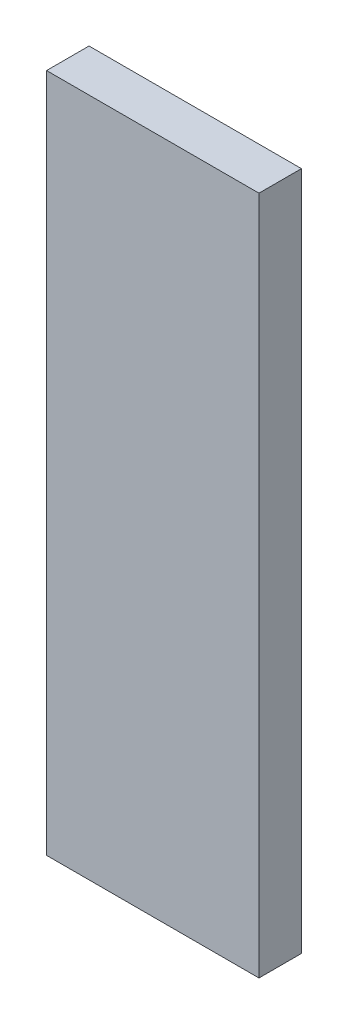
ISO-10303-21;
HEADER;
FILE_DESCRIPTION(('STEP AP214'),'2;1');
FILE_NAME('part.step','',(''),(''),'','','');
FILE_SCHEMA(('AUTOMOTIVE_DESIGN { 1 0 10303 214 1 1 1 1 }'));
ENDSEC;
DATA;
#1=APPLICATION_CONTEXT('core data for automotive mechanical design processes');
#2=APPLICATION_PROTOCOL_DEFINITION('international standard','automotive_design',2000,#1);
#3=PRODUCT_CONTEXT('',#1,'mechanical');
#4=PRODUCT('Part','Part','',(#3));
#5=PRODUCT_RELATED_PRODUCT_CATEGORY('part','',(#4));
#6=PRODUCT_DEFINITION_FORMATION('','',#4);
#7=PRODUCT_DEFINITION_CONTEXT('part definition',#1,'design');
#8=PRODUCT_DEFINITION('design','',#6,#7);
#9=PRODUCT_DEFINITION_SHAPE('','',#8);
#10=(LENGTH_UNIT() NAMED_UNIT(*) SI_UNIT(.MILLI.,.METRE.));
#11=(NAMED_UNIT(*) PLANE_ANGLE_UNIT() SI_UNIT($,.RADIAN.));
#12=(NAMED_UNIT(*) SI_UNIT($,.STERADIAN.) SOLID_ANGLE_UNIT());
#13=UNCERTAINTY_MEASURE_WITH_UNIT(LENGTH_MEASURE(1.E-05),#10,'distance_accuracy_value','');
#14=(GEOMETRIC_REPRESENTATION_CONTEXT(3) GLOBAL_UNCERTAINTY_ASSIGNED_CONTEXT((#13)) GLOBAL_UNIT_ASSIGNED_CONTEXT((#10,
#11,#12)) REPRESENTATION_CONTEXT('',''));
#15=CARTESIAN_POINT('',(0.,0.,0.));
#16=DIRECTION('',(0.,0.,1.));
#17=DIRECTION('',(1.,0.,0.));
#18=AXIS2_PLACEMENT_3D('',#15,#16,#17);
#19=CARTESIAN_POINT('',(25.,-80.,5.));
#20=DIRECTION('',(-1.,0.,0.));
#21=DIRECTION('',(0.,0.,1.));
#22=AXIS2_PLACEMENT_3D('',#19,#20,#21);
#23=PLANE('',#22);
#24=DIRECTION('',(0.,1.,0.));
#25=VECTOR('',#24,1.);
#26=CARTESIAN_POINT('',(25.,-80.,-5.));
#27=LINE('',#26,#25);
#28=CARTESIAN_POINT('',(25.,-80.,-5.));
#29=VERTEX_POINT('',#28);
#30=CARTESIAN_POINT('',(25.,80.,-5.));
#31=VERTEX_POINT('',#30);
#32=EDGE_CURVE('E102',#29,#31,#27,.T.);
#33=ORIENTED_EDGE('',*,*,#32,.T.);
#34=DIRECTION('',(0.,0.,-1.));
#35=VECTOR('',#34,1.);
#36=CARTESIAN_POINT('',(25.,80.,5.));
#37=LINE('',#36,#35);
#38=CARTESIAN_POINT('',(25.,80.,5.));
#39=VERTEX_POINT('',#38);
#40=EDGE_CURVE('E11',#39,#31,#37,.T.);
#41=ORIENTED_EDGE('',*,*,#40,.F.);
#42=DIRECTION('',(0.,1.,0.));
#43=VECTOR('',#42,1.);
#44=CARTESIAN_POINT('',(25.,-80.,5.));
#45=LINE('',#44,#43);
#46=CARTESIAN_POINT('',(25.,-80.,5.));
#47=VERTEX_POINT('',#46);
#48=EDGE_CURVE('E90',#47,#39,#45,.T.);
#49=ORIENTED_EDGE('',*,*,#48,.F.);
#50=DIRECTION('',(0.,0.,-1.));
#51=VECTOR('',#50,1.);
#52=CARTESIAN_POINT('',(25.,-80.,5.));
#53=LINE('',#52,#51);
#54=EDGE_CURVE('E98',#47,#29,#53,.T.);
#55=ORIENTED_EDGE('',*,*,#54,.T.);
#56=EDGE_LOOP('',(#33,#41,#49,#55));
#57=FACE_BOUND('',#56,.T.);
#58=ADVANCED_FACE('F39',(#57),#23,.F.);
#59=CARTESIAN_POINT('',(-25.,80.,5.));
#60=DIRECTION('',(0.,-1.,0.));
#61=DIRECTION('',(0.,0.,-1.));
#62=AXIS2_PLACEMENT_3D('',#59,#60,#61);
#63=PLANE('',#62);
#64=DIRECTION('',(-1.,0.,0.));
#65=VECTOR('',#64,1.);
#66=CARTESIAN_POINT('',(-25.,80.,-5.));
#67=LINE('',#66,#65);
#68=CARTESIAN_POINT('',(-25.,80.,-5.));
#69=VERTEX_POINT('',#68);
#70=EDGE_CURVE('E94',#31,#69,#67,.T.);
#71=ORIENTED_EDGE('',*,*,#70,.T.);
#72=DIRECTION('',(0.,0.,-1.));
#73=VECTOR('',#72,1.);
#74=CARTESIAN_POINT('',(-25.,80.,5.));
#75=LINE('',#74,#73);
#76=CARTESIAN_POINT('',(-25.,80.,5.));
#77=VERTEX_POINT('',#76);
#78=EDGE_CURVE('E47',#77,#69,#75,.T.);
#79=ORIENTED_EDGE('',*,*,#78,.F.);
#80=DIRECTION('',(-1.,0.,0.));
#81=VECTOR('',#80,1.);
#82=CARTESIAN_POINT('',(-25.,80.,5.));
#83=LINE('',#82,#81);
#84=EDGE_CURVE('E85',#39,#77,#83,.T.);
#85=ORIENTED_EDGE('',*,*,#84,.F.);
#86=ORIENTED_EDGE('',*,*,#40,.T.);
#87=EDGE_LOOP('',(#71,#79,#85,#86));
#88=FACE_BOUND('',#87,.T.);
#89=ADVANCED_FACE('F93',(#88),#63,.F.);
#90=CARTESIAN_POINT('',(-25.,-80.,5.));
#91=DIRECTION('',(1.,0.,0.));
#92=DIRECTION('',(0.,0.,-1.));
#93=AXIS2_PLACEMENT_3D('',#90,#91,#92);
#94=PLANE('',#93);
#95=DIRECTION('',(0.,-1.,0.));
#96=VECTOR('',#95,1.);
#97=CARTESIAN_POINT('',(-25.,-80.,-5.));
#98=LINE('',#97,#96);
#99=CARTESIAN_POINT('',(-25.,-80.,-5.));
#100=VERTEX_POINT('',#99);
#101=EDGE_CURVE('E72',#69,#100,#98,.T.);
#102=ORIENTED_EDGE('',*,*,#101,.T.);
#103=DIRECTION('',(0.,0.,-1.));
#104=VECTOR('',#103,1.);
#105=CARTESIAN_POINT('',(-25.,-80.,5.));
#106=LINE('',#105,#104);
#107=CARTESIAN_POINT('',(-25.,-80.,5.));
#108=VERTEX_POINT('',#107);
#109=EDGE_CURVE('E95',#108,#100,#106,.T.);
#110=ORIENTED_EDGE('',*,*,#109,.F.);
#111=DIRECTION('',(0.,-1.,0.));
#112=VECTOR('',#111,1.);
#113=CARTESIAN_POINT('',(-25.,-80.,5.));
#114=LINE('',#113,#112);
#115=EDGE_CURVE('E88',#77,#108,#114,.T.);
#116=ORIENTED_EDGE('',*,*,#115,.F.);
#117=ORIENTED_EDGE('',*,*,#78,.T.);
#118=EDGE_LOOP('',(#102,#110,#116,#117));
#119=FACE_BOUND('',#118,.T.);
#120=ADVANCED_FACE('F96',(#119),#94,.F.);
#121=CARTESIAN_POINT('',(-25.,-80.,5.));
#122=DIRECTION('',(0.,1.,0.));
#123=DIRECTION('',(0.,0.,1.));
#124=AXIS2_PLACEMENT_3D('',#121,#122,#123);
#125=PLANE('',#124);
#126=DIRECTION('',(1.,0.,0.));
#127=VECTOR('',#126,1.);
#128=CARTESIAN_POINT('',(-25.,-80.,-5.));
#129=LINE('',#128,#127);
#130=EDGE_CURVE('E78',#100,#29,#129,.T.);
#131=ORIENTED_EDGE('',*,*,#130,.T.);
#132=ORIENTED_EDGE('',*,*,#54,.F.);
#133=DIRECTION('',(1.,0.,0.));
#134=VECTOR('',#133,1.);
#135=CARTESIAN_POINT('',(-25.,-80.,5.));
#136=LINE('',#135,#134);
#137=EDGE_CURVE('E55',#108,#47,#136,.T.);
#138=ORIENTED_EDGE('',*,*,#137,.F.);
#139=ORIENTED_EDGE('',*,*,#109,.T.);
#140=EDGE_LOOP('',(#131,#132,#138,#139));
#141=FACE_BOUND('',#140,.T.);
#142=ADVANCED_FACE('F109',(#141),#125,.F.);
#143=CARTESIAN_POINT('',(0.,0.,5.));
#144=DIRECTION('',(0.,0.,-1.));
#145=DIRECTION('',(-1.,0.,0.));
#146=AXIS2_PLACEMENT_3D('',#143,#144,#145);
#147=PLANE('',#146);
#148=ORIENTED_EDGE('',*,*,#48,.T.);
#149=ORIENTED_EDGE('',*,*,#84,.T.);
#150=ORIENTED_EDGE('',*,*,#115,.T.);
#151=ORIENTED_EDGE('',*,*,#137,.T.);
#152=EDGE_LOOP('',(#148,#149,#150,#151));
#153=FACE_BOUND('',#152,.T.);
#154=ADVANCED_FACE('F86',(#153),#147,.F.);
#155=CARTESIAN_POINT('',(0.,0.,-5.));
#156=DIRECTION('',(0.,0.,-1.));
#157=DIRECTION('',(-1.,0.,0.));
#158=AXIS2_PLACEMENT_3D('',#155,#156,#157);
#159=PLANE('',#158);
#160=ORIENTED_EDGE('',*,*,#32,.F.);
#161=ORIENTED_EDGE('',*,*,#130,.F.);
#162=ORIENTED_EDGE('',*,*,#101,.F.);
#163=ORIENTED_EDGE('',*,*,#70,.F.);
#164=EDGE_LOOP('',(#160,#161,#162,#163));
#165=FACE_BOUND('',#164,.T.);
#166=ADVANCED_FACE('F112',(#165),#159,.T.);
#167=CLOSED_SHELL('',(#58,#89,#120,#142,#154,#166));
#168=MANIFOLD_SOLID_BREP('B2',#167);
#169=ADVANCED_BREP_SHAPE_REPRESENTATION('',(#18,#168),#14);
#170=SHAPE_DEFINITION_REPRESENTATION(#9,#169);
ENDSEC;
END-ISO-10303-21;
